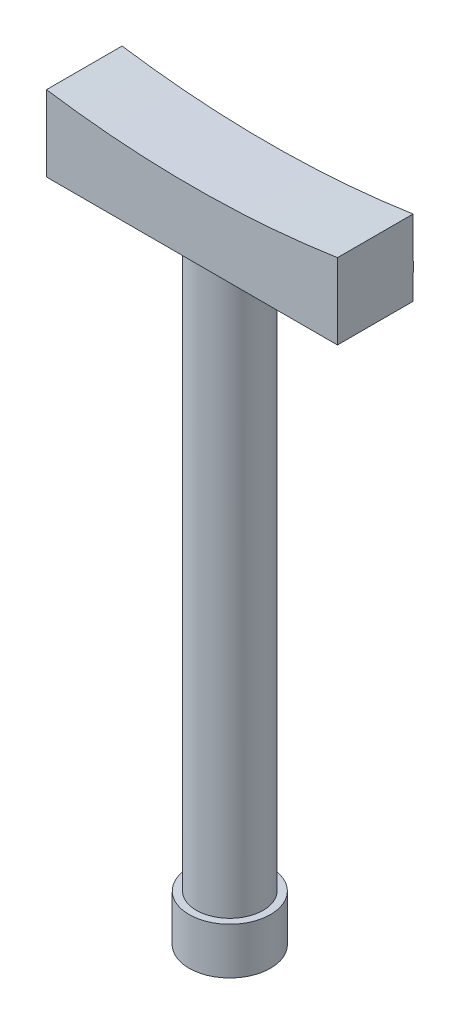
ISO-10303-21;
HEADER;
FILE_DESCRIPTION(('STEP AP214'),'2;1');
FILE_NAME('part.step','',(''),(''),'','','');
FILE_SCHEMA(('AUTOMOTIVE_DESIGN { 1 0 10303 214 1 1 1 1 }'));
ENDSEC;
DATA;
#1=APPLICATION_CONTEXT('core data for automotive mechanical design processes');
#2=APPLICATION_PROTOCOL_DEFINITION('international standard','automotive_design',2000,#1);
#3=PRODUCT_CONTEXT('',#1,'mechanical');
#4=PRODUCT('Part','Part','',(#3));
#5=PRODUCT_RELATED_PRODUCT_CATEGORY('part','',(#4));
#6=PRODUCT_DEFINITION_FORMATION('','',#4);
#7=PRODUCT_DEFINITION_CONTEXT('part definition',#1,'design');
#8=PRODUCT_DEFINITION('design','',#6,#7);
#9=PRODUCT_DEFINITION_SHAPE('','',#8);
#10=(LENGTH_UNIT() NAMED_UNIT(*) SI_UNIT(.MILLI.,.METRE.));
#11=(NAMED_UNIT(*) PLANE_ANGLE_UNIT() SI_UNIT($,.RADIAN.));
#12=(NAMED_UNIT(*) SI_UNIT($,.STERADIAN.) SOLID_ANGLE_UNIT());
#13=UNCERTAINTY_MEASURE_WITH_UNIT(LENGTH_MEASURE(1.E-05),#10,'distance_accuracy_value','');
#14=(GEOMETRIC_REPRESENTATION_CONTEXT(3) GLOBAL_UNCERTAINTY_ASSIGNED_CONTEXT((#13)) GLOBAL_UNIT_ASSIGNED_CONTEXT((#10,
#11,#12)) REPRESENTATION_CONTEXT('',''));
#15=CARTESIAN_POINT('',(0.,0.,0.));
#16=DIRECTION('',(0.,0.,1.));
#17=DIRECTION('',(1.,0.,0.));
#18=AXIS2_PLACEMENT_3D('',#15,#16,#17);
#19=CARTESIAN_POINT('',(0.,105.,0.));
#20=DIRECTION('',(0.,-1.,0.));
#21=DIRECTION('',(0.,0.,-1.));
#22=AXIS2_PLACEMENT_3D('',#19,#20,#21);
#23=CYLINDRICAL_SURFACE('',#22,5.75);
#24=CARTESIAN_POINT('',(0.,7.99999999999999,0.));
#25=DIRECTION('',(0.,1.,0.));
#26=DIRECTION('',(0.,0.,1.));
#27=AXIS2_PLACEMENT_3D('',#24,#25,#26);
#28=CIRCLE('',#27,5.75);
#29=CARTESIAN_POINT('',(0.,7.99999999999999,5.75));
#30=VERTEX_POINT('',#29);
#31=EDGE_CURVE('E47',#30,#30,#28,.T.);
#32=ORIENTED_EDGE('',*,*,#31,.T.);
#33=EDGE_LOOP('',(#32));
#34=FACE_BOUND('',#33,.T.);
#35=CARTESIAN_POINT('',(0.,105.,0.));
#36=DIRECTION('',(0.,-1.,0.));
#37=DIRECTION('',(0.,0.,-1.));
#38=AXIS2_PLACEMENT_3D('',#35,#36,#37);
#39=CIRCLE('',#38,5.75);
#40=CARTESIAN_POINT('',(0.,105.,-5.75));
#41=VERTEX_POINT('',#40);
#42=EDGE_CURVE('E141',#41,#41,#39,.T.);
#43=ORIENTED_EDGE('',*,*,#42,.T.);
#44=EDGE_LOOP('',(#43));
#45=FACE_BOUND('',#44,.T.);
#46=ADVANCED_FACE('F39',(#34,#45),#23,.T.);
#47=CARTESIAN_POINT('',(0.,105.,0.));
#48=DIRECTION('',(0.,-1.,0.));
#49=DIRECTION('',(0.,0.,-1.));
#50=AXIS2_PLACEMENT_3D('',#47,#48,#49);
#51=CYLINDRICAL_SURFACE('',#50,3.05);
#52=CARTESIAN_POINT('',(0.,105.,0.));
#53=DIRECTION('',(0.,-1.,0.));
#54=DIRECTION('',(0.,0.,-1.));
#55=AXIS2_PLACEMENT_3D('',#52,#53,#54);
#56=CIRCLE('',#55,3.05);
#57=CARTESIAN_POINT('',(0.,105.,-3.05));
#58=VERTEX_POINT('',#57);
#59=EDGE_CURVE('E142',#58,#58,#56,.T.);
#60=ORIENTED_EDGE('',*,*,#59,.F.);
#61=EDGE_LOOP('',(#60));
#62=FACE_BOUND('',#61,.T.);
#63=CARTESIAN_POINT('',(0.,0.,0.));
#64=DIRECTION('',(0.,-1.,0.));
#65=DIRECTION('',(0.,0.,-1.));
#66=AXIS2_PLACEMENT_3D('',#63,#64,#65);
#67=CIRCLE('',#66,3.05);
#68=CARTESIAN_POINT('',(0.,0.,-3.05));
#69=VERTEX_POINT('',#68);
#70=EDGE_CURVE('E146',#69,#69,#67,.T.);
#71=ORIENTED_EDGE('',*,*,#70,.T.);
#72=EDGE_LOOP('',(#71));
#73=FACE_BOUND('',#72,.T.);
#74=ADVANCED_FACE('F166',(#62,#73),#51,.F.);
#75=CARTESIAN_POINT('',(0.,8.,0.));
#76=DIRECTION('',(0.,-1.,0.));
#77=DIRECTION('',(0.,0.,-1.));
#78=AXIS2_PLACEMENT_3D('',#75,#76,#77);
#79=CYLINDRICAL_SURFACE('',#78,7.);
#80=CARTESIAN_POINT('',(0.,8.,0.));
#81=DIRECTION('',(0.,1.,0.));
#82=DIRECTION('',(0.,0.,1.));
#83=AXIS2_PLACEMENT_3D('',#80,#81,#82);
#84=CIRCLE('',#83,7.);
#85=CARTESIAN_POINT('',(0.,8.,7.));
#86=VERTEX_POINT('',#85);
#87=EDGE_CURVE('E153',#86,#86,#84,.T.);
#88=ORIENTED_EDGE('',*,*,#87,.F.);
#89=EDGE_LOOP('',(#88));
#90=FACE_BOUND('',#89,.T.);
#91=CARTESIAN_POINT('',(0.,0.,0.));
#92=DIRECTION('',(0.,1.,0.));
#93=DIRECTION('',(0.,0.,1.));
#94=AXIS2_PLACEMENT_3D('',#91,#92,#93);
#95=CIRCLE('',#94,7.);
#96=CARTESIAN_POINT('',(0.,0.,7.));
#97=VERTEX_POINT('',#96);
#98=EDGE_CURVE('E145',#97,#97,#95,.T.);
#99=ORIENTED_EDGE('',*,*,#98,.T.);
#100=EDGE_LOOP('',(#99));
#101=FACE_BOUND('',#100,.T.);
#102=ADVANCED_FACE('F41',(#90,#101),#79,.T.);
#103=CARTESIAN_POINT('',(0.,8.,0.));
#104=DIRECTION('',(0.,1.,0.));
#105=DIRECTION('',(0.,0.,1.));
#106=AXIS2_PLACEMENT_3D('',#103,#104,#105);
#107=PLANE('',#106);
#108=ORIENTED_EDGE('',*,*,#31,.F.);
#109=EDGE_LOOP('',(#108));
#110=FACE_BOUND('',#109,.T.);
#111=ORIENTED_EDGE('',*,*,#87,.T.);
#112=EDGE_LOOP('',(#111));
#113=FACE_BOUND('',#112,.T.);
#114=ADVANCED_FACE('F163',(#110,#113),#107,.T.);
#115=CARTESIAN_POINT('',(0.,0.,0.));
#116=DIRECTION('',(0.,1.,0.));
#117=DIRECTION('',(0.,0.,1.));
#118=AXIS2_PLACEMENT_3D('',#115,#116,#117);
#119=PLANE('',#118);
#120=ORIENTED_EDGE('',*,*,#98,.F.);
#121=EDGE_LOOP('',(#120));
#122=FACE_BOUND('',#121,.T.);
#123=ORIENTED_EDGE('',*,*,#70,.F.);
#124=EDGE_LOOP('',(#123));
#125=FACE_BOUND('',#124,.T.);
#126=ADVANCED_FACE('F159',(#122,#125),#119,.F.);
#127=CARTESIAN_POINT('',(0.,105.,0.));
#128=DIRECTION('',(0.,1.,0.));
#129=DIRECTION('',(0.,0.,1.));
#130=AXIS2_PLACEMENT_3D('',#127,#128,#129);
#131=PLANE('',#130);
#132=ORIENTED_EDGE('',*,*,#42,.F.);
#133=EDGE_LOOP('',(#132));
#134=FACE_BOUND('',#133,.T.);
#135=DIRECTION('',(0.,0.,-1.));
#136=VECTOR('',#135,1.);
#137=CARTESIAN_POINT('',(25.,105.,-6.5));
#138=LINE('',#137,#136);
#139=CARTESIAN_POINT('',(25.,105.,6.5));
#140=VERTEX_POINT('',#139);
#141=CARTESIAN_POINT('',(25.,105.,-6.5));
#142=VERTEX_POINT('',#141);
#143=EDGE_CURVE('E123',#140,#142,#138,.T.);
#144=ORIENTED_EDGE('',*,*,#143,.F.);
#145=DIRECTION('',(1.,0.,0.));
#146=VECTOR('',#145,1.);
#147=CARTESIAN_POINT('',(-25.,105.,6.5));
#148=LINE('',#147,#146);
#149=CARTESIAN_POINT('',(-25.,105.,6.5));
#150=VERTEX_POINT('',#149);
#151=EDGE_CURVE('E54',#150,#140,#148,.T.);
#152=ORIENTED_EDGE('',*,*,#151,.F.);
#153=DIRECTION('',(0.,0.,1.));
#154=VECTOR('',#153,1.);
#155=CARTESIAN_POINT('',(-25.,105.,-6.5));
#156=LINE('',#155,#154);
#157=CARTESIAN_POINT('',(-25.,105.,-6.5));
#158=VERTEX_POINT('',#157);
#159=EDGE_CURVE('E62',#158,#150,#156,.T.);
#160=ORIENTED_EDGE('',*,*,#159,.F.);
#161=DIRECTION('',(-1.,0.,0.));
#162=VECTOR('',#161,1.);
#163=CARTESIAN_POINT('',(-25.,105.,-6.5));
#164=LINE('',#163,#162);
#165=EDGE_CURVE('E130',#142,#158,#164,.T.);
#166=ORIENTED_EDGE('',*,*,#165,.F.);
#167=EDGE_LOOP('',(#144,#152,#160,#166));
#168=FACE_BOUND('',#167,.T.);
#169=ADVANCED_FACE('F162',(#134,#168),#131,.F.);
#170=CARTESIAN_POINT('',(-25.,109.,6.5));
#171=DIRECTION('',(0.,0.,-1.));
#172=DIRECTION('',(-1.,0.,0.));
#173=AXIS2_PLACEMENT_3D('',#170,#171,#172);
#174=PLANE('',#173);
#175=DIRECTION('',(0.,-1.,0.));
#176=VECTOR('',#175,1.);
#177=CARTESIAN_POINT('',(25.,109.,6.5));
#178=LINE('',#177,#176);
#179=CARTESIAN_POINT('',(25.,118.,6.49999999999999));
#180=VERTEX_POINT('',#179);
#181=EDGE_CURVE('E127',#180,#140,#178,.T.);
#182=ORIENTED_EDGE('',*,*,#181,.F.);
#183=CARTESIAN_POINT('',(0.,283.659610879236,6.50000000000001));
#184=DIRECTION('',(0.,0.,-1.));
#185=DIRECTION('',(-1.,0.,0.));
#186=AXIS2_PLACEMENT_3D('',#183,#184,#185);
#187=CIRCLE('',#186,167.535389326135);
#188=CARTESIAN_POINT('',(-25.,118.,6.49999999999999));
#189=VERTEX_POINT('',#188);
#190=EDGE_CURVE('E103',#180,#189,#187,.T.);
#191=ORIENTED_EDGE('',*,*,#190,.T.);
#192=DIRECTION('',(0.,-1.,0.));
#193=VECTOR('',#192,1.);
#194=CARTESIAN_POINT('',(-25.,109.,6.5));
#195=LINE('',#194,#193);
#196=EDGE_CURVE('E109',#189,#150,#195,.T.);
#197=ORIENTED_EDGE('',*,*,#196,.T.);
#198=ORIENTED_EDGE('',*,*,#151,.T.);
#199=EDGE_LOOP('',(#182,#191,#197,#198));
#200=FACE_BOUND('',#199,.T.);
#201=ADVANCED_FACE('F194',(#200),#174,.F.);
#202=CARTESIAN_POINT('',(-25.,109.,-6.5));
#203=DIRECTION('',(1.,0.,0.));
#204=DIRECTION('',(0.,0.,-1.));
#205=AXIS2_PLACEMENT_3D('',#202,#203,#204);
#206=PLANE('',#205);
#207=DIRECTION('',(0.,1.,0.));
#208=VECTOR('',#207,1.);
#209=CARTESIAN_POINT('',(-25.,108.,-6.4913281951843));
#210=LINE('',#209,#208);
#211=CARTESIAN_POINT('',(-25.,111.305216545749,-6.4913281951843));
#212=VERTEX_POINT('',#211);
#213=CARTESIAN_POINT('',(-25.,118.,-6.4913281951843));
#214=VERTEX_POINT('',#213);
#215=EDGE_CURVE('E107',#212,#214,#210,.T.);
#216=ORIENTED_EDGE('',*,*,#215,.F.);
#217=CARTESIAN_POINT('',(-25.,110.122992716923,1.37700728307714));
#218=DIRECTION('',(-1.,0.,0.));
#219=DIRECTION('',(0.,0.,1.));
#220=AXIS2_PLACEMENT_3D('',#217,#218,#219);
#221=CIRCLE('',#220,7.9566548486102);
#222=CARTESIAN_POINT('',(-25.,109.,-6.5));
#223=VERTEX_POINT('',#222);
#224=EDGE_CURVE('E114',#212,#223,#221,.T.);
#225=ORIENTED_EDGE('',*,*,#224,.T.);
#226=DIRECTION('',(0.,-1.,0.));
#227=VECTOR('',#226,1.);
#228=CARTESIAN_POINT('',(-25.,109.,-6.5));
#229=LINE('',#228,#227);
#230=EDGE_CURVE('E136',#223,#158,#229,.T.);
#231=ORIENTED_EDGE('',*,*,#230,.T.);
#232=ORIENTED_EDGE('',*,*,#159,.T.);
#233=ORIENTED_EDGE('',*,*,#196,.F.);
#234=DIRECTION('',(0.,0.,1.));
#235=VECTOR('',#234,1.);
#236=CARTESIAN_POINT('',(-25.,118.,0.254014566154174));
#237=LINE('',#236,#235);
#238=EDGE_CURVE('E96',#214,#189,#237,.T.);
#239=ORIENTED_EDGE('',*,*,#238,.F.);
#240=EDGE_LOOP('',(#216,#225,#231,#232,#233,#239));
#241=FACE_BOUND('',#240,.T.);
#242=ADVANCED_FACE('F106',(#241),#206,.F.);
#243=CARTESIAN_POINT('',(-25.,109.,-6.5));
#244=DIRECTION('',(0.,0.,1.));
#245=DIRECTION('',(1.,0.,0.));
#246=AXIS2_PLACEMENT_3D('',#243,#244,#245);
#247=PLANE('',#246);
#248=ORIENTED_EDGE('',*,*,#165,.T.);
#249=ORIENTED_EDGE('',*,*,#230,.F.);
#250=DIRECTION('',(-1.,0.,0.));
#251=VECTOR('',#250,1.);
#252=CARTESIAN_POINT('',(-25.,109.,-6.5));
#253=LINE('',#252,#251);
#254=CARTESIAN_POINT('',(25.,109.,-6.5));
#255=VERTEX_POINT('',#254);
#256=EDGE_CURVE('E124',#255,#223,#253,.T.);
#257=ORIENTED_EDGE('',*,*,#256,.F.);
#258=DIRECTION('',(0.,-1.,0.));
#259=VECTOR('',#258,1.);
#260=CARTESIAN_POINT('',(25.,109.,-6.5));
#261=LINE('',#260,#259);
#262=EDGE_CURVE('E138',#255,#142,#261,.T.);
#263=ORIENTED_EDGE('',*,*,#262,.T.);
#264=EDGE_LOOP('',(#248,#249,#257,#263));
#265=FACE_BOUND('',#264,.T.);
#266=ADVANCED_FACE('F208',(#265),#247,.F.);
#267=CARTESIAN_POINT('',(25.,109.,-6.5));
#268=DIRECTION('',(-1.,0.,0.));
#269=DIRECTION('',(0.,0.,1.));
#270=AXIS2_PLACEMENT_3D('',#267,#268,#269);
#271=PLANE('',#270);
#272=DIRECTION('',(0.,1.,0.));
#273=VECTOR('',#272,1.);
#274=CARTESIAN_POINT('',(25.,108.,-6.4913281951843));
#275=LINE('',#274,#273);
#276=CARTESIAN_POINT('',(25.,111.305216545749,-6.4913281951843));
#277=VERTEX_POINT('',#276);
#278=CARTESIAN_POINT('',(25.,118.,-6.4913281951843));
#279=VERTEX_POINT('',#278);
#280=EDGE_CURVE('E115',#277,#279,#275,.T.);
#281=ORIENTED_EDGE('',*,*,#280,.T.);
#282=DIRECTION('',(0.,0.,-1.));
#283=VECTOR('',#282,1.);
#284=CARTESIAN_POINT('',(25.,118.,0.254014566154174));
#285=LINE('',#284,#283);
#286=EDGE_CURVE('E99',#180,#279,#285,.T.);
#287=ORIENTED_EDGE('',*,*,#286,.F.);
#288=ORIENTED_EDGE('',*,*,#181,.T.);
#289=ORIENTED_EDGE('',*,*,#143,.T.);
#290=ORIENTED_EDGE('',*,*,#262,.F.);
#291=CARTESIAN_POINT('',(25.,110.122992716923,1.37700728307714));
#292=DIRECTION('',(-1.,0.,0.));
#293=DIRECTION('',(0.,0.,1.));
#294=AXIS2_PLACEMENT_3D('',#291,#292,#293);
#295=CIRCLE('',#294,7.9566548486102);
#296=EDGE_CURVE('E110',#277,#255,#295,.T.);
#297=ORIENTED_EDGE('',*,*,#296,.F.);
#298=EDGE_LOOP('',(#281,#287,#288,#289,#290,#297));
#299=FACE_BOUND('',#298,.T.);
#300=ADVANCED_FACE('F179',(#299),#271,.F.);
#301=ORIENTED_EDGE('',*,*,#59,.T.);
#302=EDGE_LOOP('',(#301));
#303=FACE_BOUND('',#302,.T.);
#304=ADVANCED_FACE('F196',(#303),#131,.F.);
#305=CARTESIAN_POINT('',(25.,110.122992716923,1.37700728307714));
#306=DIRECTION('',(-1.,0.,0.));
#307=DIRECTION('',(0.,0.,1.));
#308=AXIS2_PLACEMENT_3D('',#305,#306,#307);
#309=CYLINDRICAL_SURFACE('',#308,7.9566548486102);
#310=DIRECTION('',(-1.,0.,0.));
#311=VECTOR('',#310,1.);
#312=CARTESIAN_POINT('',(25.,111.305216545749,-6.4913281951843));
#313=LINE('',#312,#311);
#314=EDGE_CURVE('E11',#277,#212,#313,.T.);
#315=ORIENTED_EDGE('',*,*,#314,.F.);
#316=ORIENTED_EDGE('',*,*,#296,.T.);
#317=ORIENTED_EDGE('',*,*,#256,.T.);
#318=ORIENTED_EDGE('',*,*,#224,.F.);
#319=EDGE_LOOP('',(#315,#316,#317,#318));
#320=FACE_BOUND('',#319,.T.);
#321=ADVANCED_FACE('F220',(#320),#309,.T.);
#322=CARTESIAN_POINT('',(25.,108.,-6.4913281951843));
#323=DIRECTION('',(0.,0.,-1.));
#324=DIRECTION('',(-1.,0.,0.));
#325=AXIS2_PLACEMENT_3D('',#322,#323,#324);
#326=PLANE('',#325);
#327=CARTESIAN_POINT('',(0.,283.659610879236,-6.4913281951843));
#328=DIRECTION('',(0.,0.,-1.));
#329=DIRECTION('',(-1.,0.,0.));
#330=AXIS2_PLACEMENT_3D('',#327,#328,#329);
#331=CIRCLE('',#330,167.535389326135);
#332=EDGE_CURVE('E93',#279,#214,#331,.T.);
#333=ORIENTED_EDGE('',*,*,#332,.F.);
#334=ORIENTED_EDGE('',*,*,#280,.F.);
#335=ORIENTED_EDGE('',*,*,#314,.T.);
#336=ORIENTED_EDGE('',*,*,#215,.T.);
#337=EDGE_LOOP('',(#333,#334,#335,#336));
#338=FACE_BOUND('',#337,.T.);
#339=ADVANCED_FACE('F112',(#338),#326,.T.);
#340=CARTESIAN_POINT('',(0.,283.659610879236,93.5086718048157));
#341=DIRECTION('',(0.,0.,-1.));
#342=DIRECTION('',(-1.,0.,0.));
#343=AXIS2_PLACEMENT_3D('',#340,#341,#342);
#344=CYLINDRICAL_SURFACE('',#343,167.535389326135);
#345=ORIENTED_EDGE('',*,*,#286,.T.);
#346=ORIENTED_EDGE('',*,*,#332,.T.);
#347=ORIENTED_EDGE('',*,*,#238,.T.);
#348=ORIENTED_EDGE('',*,*,#190,.F.);
#349=EDGE_LOOP('',(#345,#346,#347,#348));
#350=FACE_BOUND('',#349,.T.);
#351=ADVANCED_FACE('F95',(#350),#344,.F.);
#352=CLOSED_SHELL('',(#46,#74,#102,#114,#126,#169,#201,#242,#266,#300,#304,#321,#339,#351));
#353=MANIFOLD_SOLID_BREP('B2',#352);
#354=ADVANCED_BREP_SHAPE_REPRESENTATION('',(#18,#353),#14);
#355=SHAPE_DEFINITION_REPRESENTATION(#9,#354);
ENDSEC;
END-ISO-10303-21;
